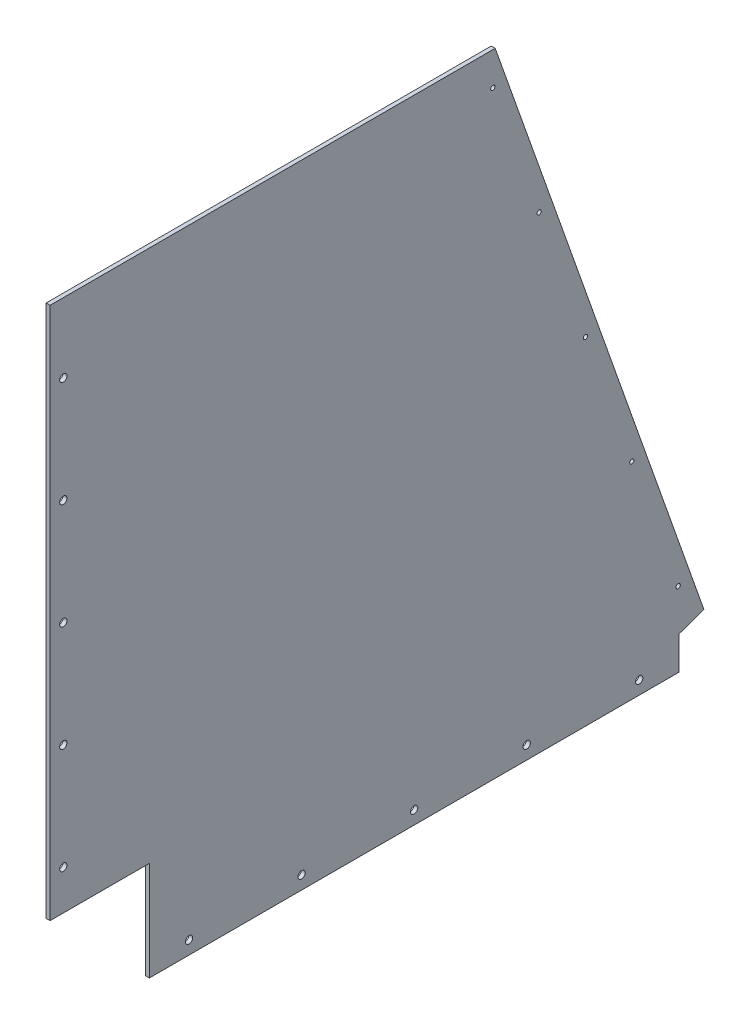
ISO-10303-21;
HEADER;
FILE_DESCRIPTION(('STEP AP214'),'2;1');
FILE_NAME('part.step','',(''),(''),'','','');
FILE_SCHEMA(('AUTOMOTIVE_DESIGN { 1 0 10303 214 1 1 1 1 }'));
ENDSEC;
DATA;
#1=APPLICATION_CONTEXT('core data for automotive mechanical design processes');
#2=APPLICATION_PROTOCOL_DEFINITION('international standard','automotive_design',2000,#1);
#3=PRODUCT_CONTEXT('',#1,'mechanical');
#4=PRODUCT('Part','Part','',(#3));
#5=PRODUCT_RELATED_PRODUCT_CATEGORY('part','',(#4));
#6=PRODUCT_DEFINITION_FORMATION('','',#4);
#7=PRODUCT_DEFINITION_CONTEXT('part definition',#1,'design');
#8=PRODUCT_DEFINITION('design','',#6,#7);
#9=PRODUCT_DEFINITION_SHAPE('','',#8);
#10=(LENGTH_UNIT() NAMED_UNIT(*) SI_UNIT(.MILLI.,.METRE.));
#11=(NAMED_UNIT(*) PLANE_ANGLE_UNIT() SI_UNIT($,.RADIAN.));
#12=(NAMED_UNIT(*) SI_UNIT($,.STERADIAN.) SOLID_ANGLE_UNIT());
#13=UNCERTAINTY_MEASURE_WITH_UNIT(LENGTH_MEASURE(1.E-05),#10,'distance_accuracy_value','');
#14=(GEOMETRIC_REPRESENTATION_CONTEXT(3) GLOBAL_UNCERTAINTY_ASSIGNED_CONTEXT((#13)) GLOBAL_UNIT_ASSIGNED_CONTEXT((#10,
#11,#12)) REPRESENTATION_CONTEXT('',''));
#15=CARTESIAN_POINT('',(0.,0.,0.));
#16=DIRECTION('',(0.,0.,1.));
#17=DIRECTION('',(1.,0.,0.));
#18=AXIS2_PLACEMENT_3D('',#15,#16,#17);
#19=CARTESIAN_POINT('',(3.,0.,0.));
#20=DIRECTION('',(-1.,0.,0.));
#21=DIRECTION('',(0.,0.,1.));
#22=AXIS2_PLACEMENT_3D('',#19,#20,#21);
#23=PLANE('',#22);
#24=CARTESIAN_POINT('',(3.,501.627796268499,-86.0977592121409));
#25=DIRECTION('',(1.,0.,0.));
#26=DIRECTION('',(0.,0.,-1.));
#27=AXIS2_PLACEMENT_3D('',#24,#25,#26);
#28=CIRCLE('',#27,1.60000000000005);
#29=CARTESIAN_POINT('',(3.,501.627796268499,-87.6977592121409));
#30=VERTEX_POINT('',#29);
#31=EDGE_CURVE('E185',#30,#30,#28,.T.);
#32=ORIENTED_EDGE('',*,*,#31,.F.);
#33=EDGE_LOOP('',(#32));
#34=FACE_BOUND('',#33,.T.);
#35=CARTESIAN_POINT('',(3.,600.622745634616,-51.0977592121409));
#36=DIRECTION('',(1.,0.,0.));
#37=DIRECTION('',(0.,0.,-1.));
#38=AXIS2_PLACEMENT_3D('',#35,#36,#37);
#39=CIRCLE('',#38,1.60000000000005);
#40=CARTESIAN_POINT('',(3.,600.622745634616,-52.6977592121409));
#41=VERTEX_POINT('',#40);
#42=EDGE_CURVE('E179',#41,#41,#39,.T.);
#43=ORIENTED_EDGE('',*,*,#42,.F.);
#44=EDGE_LOOP('',(#43));
#45=FACE_BOUND('',#44,.T.);
#46=DIRECTION('',(0.,-0.942809041582063,-0.333333333333333));
#47=VECTOR('',#46,1.);
#48=CARTESIAN_POINT('',(3.,632.240350215411,-50.5258496279613));
#49=LINE('',#48,#47);
#50=CARTESIAN_POINT('',(3.,625.573683548744,-52.8828722319166));
#51=VERTEX_POINT('',#50);
#52=CARTESIAN_POINT('',(3.,179.69201025602,-210.525849627961));
#53=VERTEX_POINT('',#52);
#54=EDGE_CURVE('E123',#51,#53,#49,.T.);
#55=ORIENTED_EDGE('',*,*,#54,.F.);
#56=DIRECTION('',(0.,0.,1.));
#57=VECTOR('',#56,1.);
#58=CARTESIAN_POINT('',(3.,625.573683548744,258.33033120368));
#59=LINE('',#58,#57);
#60=CARTESIAN_POINT('',(3.,625.573683548744,283.33033120368));
#61=VERTEX_POINT('',#60);
#62=EDGE_CURVE('E51',#51,#61,#59,.T.);
#63=ORIENTED_EDGE('',*,*,#62,.T.);
#64=DIRECTION('',(0.,1.,0.));
#65=VECTOR('',#64,1.);
#66=CARTESIAN_POINT('',(3.,625.573683548744,283.33033120368));
#67=LINE('',#66,#65);
#68=CARTESIAN_POINT('',(3.,223.025343589353,283.33033120368));
#69=VERTEX_POINT('',#68);
#70=EDGE_CURVE('E167',#69,#61,#67,.T.);
#71=ORIENTED_EDGE('',*,*,#70,.F.);
#72=DIRECTION('',(0.,0.,-1.));
#73=VECTOR('',#72,1.);
#74=CARTESIAN_POINT('',(3.,223.025343589353,0.));
#75=LINE('',#74,#73);
#76=CARTESIAN_POINT('',(3.,223.025343589353,208.33033120368));
#77=VERTEX_POINT('',#76);
#78=EDGE_CURVE('E136',#69,#77,#75,.T.);
#79=ORIENTED_EDGE('',*,*,#78,.T.);
#80=DIRECTION('',(0.,-1.,0.));
#81=VECTOR('',#80,1.);
#82=CARTESIAN_POINT('',(3.,0.,208.33033120368));
#83=LINE('',#82,#81);
#84=CARTESIAN_POINT('',(3.,148.025343589354,208.33033120368));
#85=VERTEX_POINT('',#84);
#86=EDGE_CURVE('E111',#77,#85,#83,.T.);
#87=ORIENTED_EDGE('',*,*,#86,.T.);
#88=DIRECTION('',(0.,0.,1.));
#89=VECTOR('',#88,1.);
#90=CARTESIAN_POINT('',(3.,148.025343589354,208.33033120368));
#91=LINE('',#90,#89);
#92=CARTESIAN_POINT('',(3.,148.025343589354,-191.66966879632));
#93=VERTEX_POINT('',#92);
#94=EDGE_CURVE('E162',#93,#85,#91,.T.);
#95=ORIENTED_EDGE('',*,*,#94,.F.);
#96=DIRECTION('',(0.,1.,0.));
#97=VECTOR('',#96,1.);
#98=CARTESIAN_POINT('',(3.,148.025343589354,-191.66966879632));
#99=LINE('',#98,#97);
#100=CARTESIAN_POINT('',(3.,173.025343589354,-191.66966879632));
#101=VERTEX_POINT('',#100);
#102=EDGE_CURVE('E148',#93,#101,#99,.T.);
#103=ORIENTED_EDGE('',*,*,#102,.T.);
#104=DIRECTION('',(0.,-0.333333333333333,0.942809041582063));
#105=VECTOR('',#104,1.);
#106=CARTESIAN_POINT('',(3.,179.69201025602,-210.525849627961));
#107=LINE('',#106,#105);
#108=EDGE_CURVE('E121',#53,#101,#107,.T.);
#109=ORIENTED_EDGE('',*,*,#108,.F.);
#110=EDGE_LOOP('',(#55,#63,#71,#79,#87,#95,#103,#109));
#111=FACE_BOUND('',#110,.T.);
#112=CARTESIAN_POINT('',(3.,402.632846902382,-121.097759212141));
#113=DIRECTION('',(1.,0.,0.));
#114=DIRECTION('',(0.,0.,-1.));
#115=AXIS2_PLACEMENT_3D('',#112,#113,#114);
#116=CIRCLE('',#115,1.59999999999999);
#117=CARTESIAN_POINT('',(3.,402.632846902382,-122.697759212141));
#118=VERTEX_POINT('',#117);
#119=EDGE_CURVE('E191',#118,#118,#116,.T.);
#120=ORIENTED_EDGE('',*,*,#119,.F.);
#121=EDGE_LOOP('',(#120));
#122=FACE_BOUND('',#121,.T.);
#123=CARTESIAN_POINT('',(3.,303.637897536266,-156.097759212141));
#124=DIRECTION('',(1.,0.,0.));
#125=DIRECTION('',(0.,0.,-1.));
#126=AXIS2_PLACEMENT_3D('',#123,#124,#125);
#127=CIRCLE('',#126,1.59999999999999);
#128=CARTESIAN_POINT('',(3.,303.637897536266,-157.697759212141));
#129=VERTEX_POINT('',#128);
#130=EDGE_CURVE('E197',#129,#129,#127,.T.);
#131=ORIENTED_EDGE('',*,*,#130,.F.);
#132=EDGE_LOOP('',(#131));
#133=FACE_BOUND('',#132,.T.);
#134=CARTESIAN_POINT('',(3.,204.642948170149,-191.097759212141));
#135=DIRECTION('',(1.,0.,0.));
#136=DIRECTION('',(0.,0.,-1.));
#137=AXIS2_PLACEMENT_3D('',#134,#135,#136);
#138=CIRCLE('',#137,1.59999999999999);
#139=CARTESIAN_POINT('',(3.,204.642948170149,-192.697759212141));
#140=VERTEX_POINT('',#139);
#141=EDGE_CURVE('E203',#140,#140,#138,.T.);
#142=ORIENTED_EDGE('',*,*,#141,.F.);
#143=EDGE_LOOP('',(#142));
#144=FACE_BOUND('',#143,.T.);
#145=CARTESIAN_POINT('',(3.,573.025343589353,273.33033120368));
#146=DIRECTION('',(1.,0.,0.));
#147=DIRECTION('',(0.,0.,-1.));
#148=AXIS2_PLACEMENT_3D('',#145,#146,#147);
#149=CIRCLE('',#148,2.75000000000003);
#150=CARTESIAN_POINT('',(3.,573.025343589353,270.58033120368));
#151=VERTEX_POINT('',#150);
#152=EDGE_CURVE('E209',#151,#151,#149,.T.);
#153=ORIENTED_EDGE('',*,*,#152,.F.);
#154=EDGE_LOOP('',(#153));
#155=FACE_BOUND('',#154,.T.);
#156=CARTESIAN_POINT('',(3.,493.025343589353,273.33033120368));
#157=DIRECTION('',(1.,0.,0.));
#158=DIRECTION('',(0.,0.,-1.));
#159=AXIS2_PLACEMENT_3D('',#156,#157,#158);
#160=CIRCLE('',#159,2.74999999999997);
#161=CARTESIAN_POINT('',(3.,493.025343589353,270.58033120368));
#162=VERTEX_POINT('',#161);
#163=EDGE_CURVE('E215',#162,#162,#160,.T.);
#164=ORIENTED_EDGE('',*,*,#163,.F.);
#165=EDGE_LOOP('',(#164));
#166=FACE_BOUND('',#165,.T.);
#167=CARTESIAN_POINT('',(3.,413.025343589353,273.33033120368));
#168=DIRECTION('',(1.,0.,0.));
#169=DIRECTION('',(0.,0.,-1.));
#170=AXIS2_PLACEMENT_3D('',#167,#168,#169);
#171=CIRCLE('',#170,2.74999999999997);
#172=CARTESIAN_POINT('',(3.,413.025343589353,270.58033120368));
#173=VERTEX_POINT('',#172);
#174=EDGE_CURVE('E221',#173,#173,#171,.T.);
#175=ORIENTED_EDGE('',*,*,#174,.F.);
#176=EDGE_LOOP('',(#175));
#177=FACE_BOUND('',#176,.T.);
#178=CARTESIAN_POINT('',(3.,333.025343589353,273.33033120368));
#179=DIRECTION('',(1.,0.,0.));
#180=DIRECTION('',(0.,0.,-1.));
#181=AXIS2_PLACEMENT_3D('',#178,#179,#180);
#182=CIRCLE('',#181,2.74999999999997);
#183=CARTESIAN_POINT('',(3.,333.025343589353,270.58033120368));
#184=VERTEX_POINT('',#183);
#185=EDGE_CURVE('E227',#184,#184,#182,.T.);
#186=ORIENTED_EDGE('',*,*,#185,.F.);
#187=EDGE_LOOP('',(#186));
#188=FACE_BOUND('',#187,.T.);
#189=CARTESIAN_POINT('',(3.,253.025343589353,273.33033120368));
#190=DIRECTION('',(1.,0.,0.));
#191=DIRECTION('',(0.,0.,-1.));
#192=AXIS2_PLACEMENT_3D('',#189,#190,#191);
#193=CIRCLE('',#192,2.74999999999997);
#194=CARTESIAN_POINT('',(3.,253.025343589353,270.58033120368));
#195=VERTEX_POINT('',#194);
#196=EDGE_CURVE('E233',#195,#195,#193,.T.);
#197=ORIENTED_EDGE('',*,*,#196,.F.);
#198=EDGE_LOOP('',(#197));
#199=FACE_BOUND('',#198,.T.);
#200=CARTESIAN_POINT('',(3.,158.025343589354,178.33033120368));
#201=DIRECTION('',(1.,0.,0.));
#202=DIRECTION('',(0.,0.,-1.));
#203=AXIS2_PLACEMENT_3D('',#200,#201,#202);
#204=CIRCLE('',#203,2.75);
#205=CARTESIAN_POINT('',(3.,158.025343589354,175.58033120368));
#206=VERTEX_POINT('',#205);
#207=EDGE_CURVE('E239',#206,#206,#204,.T.);
#208=ORIENTED_EDGE('',*,*,#207,.F.);
#209=EDGE_LOOP('',(#208));
#210=FACE_BOUND('',#209,.T.);
#211=CARTESIAN_POINT('',(3.,158.025343589354,93.3303312036799));
#212=DIRECTION('',(1.,0.,0.));
#213=DIRECTION('',(0.,0.,-1.));
#214=AXIS2_PLACEMENT_3D('',#211,#212,#213);
#215=CIRCLE('',#214,2.75);
#216=CARTESIAN_POINT('',(3.,158.025343589354,90.5803312036799));
#217=VERTEX_POINT('',#216);
#218=EDGE_CURVE('E245',#217,#217,#215,.T.);
#219=ORIENTED_EDGE('',*,*,#218,.F.);
#220=EDGE_LOOP('',(#219));
#221=FACE_BOUND('',#220,.T.);
#222=CARTESIAN_POINT('',(3.,158.025343589354,8.33033120367988));
#223=DIRECTION('',(1.,0.,0.));
#224=DIRECTION('',(0.,0.,-1.));
#225=AXIS2_PLACEMENT_3D('',#222,#223,#224);
#226=CIRCLE('',#225,2.75);
#227=CARTESIAN_POINT('',(3.,158.025343589354,5.58033120367987));
#228=VERTEX_POINT('',#227);
#229=EDGE_CURVE('E251',#228,#228,#226,.T.);
#230=ORIENTED_EDGE('',*,*,#229,.F.);
#231=EDGE_LOOP('',(#230));
#232=FACE_BOUND('',#231,.T.);
#233=CARTESIAN_POINT('',(3.,158.025343589354,-76.6696687963201));
#234=DIRECTION('',(1.,0.,0.));
#235=DIRECTION('',(0.,0.,-1.));
#236=AXIS2_PLACEMENT_3D('',#233,#234,#235);
#237=CIRCLE('',#236,2.75);
#238=CARTESIAN_POINT('',(3.,158.025343589354,-79.4196687963201));
#239=VERTEX_POINT('',#238);
#240=EDGE_CURVE('E257',#239,#239,#237,.T.);
#241=ORIENTED_EDGE('',*,*,#240,.F.);
#242=EDGE_LOOP('',(#241));
#243=FACE_BOUND('',#242,.T.);
#244=CARTESIAN_POINT('',(3.,158.025343589354,-161.66966879632));
#245=DIRECTION('',(1.,0.,0.));
#246=DIRECTION('',(0.,0.,-1.));
#247=AXIS2_PLACEMENT_3D('',#244,#245,#246);
#248=CIRCLE('',#247,2.75);
#249=CARTESIAN_POINT('',(3.,158.025343589354,-164.41966879632));
#250=VERTEX_POINT('',#249);
#251=EDGE_CURVE('E263',#250,#250,#248,.T.);
#252=ORIENTED_EDGE('',*,*,#251,.F.);
#253=EDGE_LOOP('',(#252));
#254=FACE_BOUND('',#253,.T.);
#255=ADVANCED_FACE('F37',(#34,#45,#111,#122,#133,#144,#155,#166,#177,#188,#199,#210,#221,#232,
#243,#254),#23,.F.);
#256=CARTESIAN_POINT('',(3.,625.573683548744,258.33033120368));
#257=DIRECTION('',(0.,-1.,0.));
#258=DIRECTION('',(0.,0.,-1.));
#259=AXIS2_PLACEMENT_3D('',#256,#257,#258);
#260=PLANE('',#259);
#261=DIRECTION('',(0.,0.,1.));
#262=VECTOR('',#261,1.);
#263=CARTESIAN_POINT('',(0.,625.573683548744,258.33033120368));
#264=LINE('',#263,#262);
#265=CARTESIAN_POINT('',(0.,625.573683548744,-52.8828722319166));
#266=VERTEX_POINT('',#265);
#267=CARTESIAN_POINT('',(0.,625.573683548744,283.33033120368));
#268=VERTEX_POINT('',#267);
#269=EDGE_CURVE('E103',#266,#268,#264,.T.);
#270=ORIENTED_EDGE('',*,*,#269,.T.);
#271=DIRECTION('',(-1.,0.,0.));
#272=VECTOR('',#271,1.);
#273=CARTESIAN_POINT('',(0.,625.573683548744,283.33033120368));
#274=LINE('',#273,#272);
#275=EDGE_CURVE('E165',#61,#268,#274,.T.);
#276=ORIENTED_EDGE('',*,*,#275,.F.);
#277=ORIENTED_EDGE('',*,*,#62,.F.);
#278=DIRECTION('',(-1.,0.,0.));
#279=VECTOR('',#278,1.);
#280=CARTESIAN_POINT('',(0.,625.573683548744,-52.8828722319166));
#281=LINE('',#280,#279);
#282=EDGE_CURVE('E11',#51,#266,#281,.T.);
#283=ORIENTED_EDGE('',*,*,#282,.T.);
#284=EDGE_LOOP('',(#270,#276,#277,#283));
#285=FACE_BOUND('',#284,.T.);
#286=ADVANCED_FACE('F39',(#285),#260,.F.);
#287=CARTESIAN_POINT('',(0.,0.,0.));
#288=DIRECTION('',(-1.,0.,0.));
#289=DIRECTION('',(0.,0.,1.));
#290=AXIS2_PLACEMENT_3D('',#287,#288,#289);
#291=PLANE('',#290);
#292=CARTESIAN_POINT('',(0.,158.025343589354,-161.66966879632));
#293=DIRECTION('',(-1.,0.,0.));
#294=DIRECTION('',(0.,0.,1.));
#295=AXIS2_PLACEMENT_3D('',#292,#293,#294);
#296=CIRCLE('',#295,2.75);
#297=CARTESIAN_POINT('',(0.,158.025343589354,-158.91966879632));
#298=VERTEX_POINT('',#297);
#299=EDGE_CURVE('E260',#298,#298,#296,.T.);
#300=ORIENTED_EDGE('',*,*,#299,.F.);
#301=EDGE_LOOP('',(#300));
#302=FACE_BOUND('',#301,.T.);
#303=CARTESIAN_POINT('',(0.,158.025343589354,-76.6696687963201));
#304=DIRECTION('',(-1.,0.,0.));
#305=DIRECTION('',(0.,0.,1.));
#306=AXIS2_PLACEMENT_3D('',#303,#304,#305);
#307=CIRCLE('',#306,2.75);
#308=CARTESIAN_POINT('',(0.,158.025343589354,-73.9196687963201));
#309=VERTEX_POINT('',#308);
#310=EDGE_CURVE('E254',#309,#309,#307,.T.);
#311=ORIENTED_EDGE('',*,*,#310,.F.);
#312=EDGE_LOOP('',(#311));
#313=FACE_BOUND('',#312,.T.);
#314=CARTESIAN_POINT('',(0.,158.025343589354,8.33033120367988));
#315=DIRECTION('',(-1.,0.,0.));
#316=DIRECTION('',(0.,0.,1.));
#317=AXIS2_PLACEMENT_3D('',#314,#315,#316);
#318=CIRCLE('',#317,2.75);
#319=CARTESIAN_POINT('',(0.,158.025343589354,11.0803312036799));
#320=VERTEX_POINT('',#319);
#321=EDGE_CURVE('E248',#320,#320,#318,.T.);
#322=ORIENTED_EDGE('',*,*,#321,.F.);
#323=EDGE_LOOP('',(#322));
#324=FACE_BOUND('',#323,.T.);
#325=CARTESIAN_POINT('',(0.,158.025343589354,93.3303312036799));
#326=DIRECTION('',(-1.,0.,0.));
#327=DIRECTION('',(0.,0.,1.));
#328=AXIS2_PLACEMENT_3D('',#325,#326,#327);
#329=CIRCLE('',#328,2.75);
#330=CARTESIAN_POINT('',(0.,158.025343589354,96.0803312036799));
#331=VERTEX_POINT('',#330);
#332=EDGE_CURVE('E242',#331,#331,#329,.T.);
#333=ORIENTED_EDGE('',*,*,#332,.F.);
#334=EDGE_LOOP('',(#333));
#335=FACE_BOUND('',#334,.T.);
#336=CARTESIAN_POINT('',(0.,158.025343589354,178.33033120368));
#337=DIRECTION('',(-1.,0.,0.));
#338=DIRECTION('',(0.,0.,1.));
#339=AXIS2_PLACEMENT_3D('',#336,#337,#338);
#340=CIRCLE('',#339,2.75);
#341=CARTESIAN_POINT('',(0.,158.025343589354,181.08033120368));
#342=VERTEX_POINT('',#341);
#343=EDGE_CURVE('E236',#342,#342,#340,.T.);
#344=ORIENTED_EDGE('',*,*,#343,.F.);
#345=EDGE_LOOP('',(#344));
#346=FACE_BOUND('',#345,.T.);
#347=CARTESIAN_POINT('',(0.,253.025343589353,273.33033120368));
#348=DIRECTION('',(-1.,0.,0.));
#349=DIRECTION('',(0.,0.,1.));
#350=AXIS2_PLACEMENT_3D('',#347,#348,#349);
#351=CIRCLE('',#350,2.74999999999997);
#352=CARTESIAN_POINT('',(0.,253.025343589353,276.08033120368));
#353=VERTEX_POINT('',#352);
#354=EDGE_CURVE('E230',#353,#353,#351,.T.);
#355=ORIENTED_EDGE('',*,*,#354,.F.);
#356=EDGE_LOOP('',(#355));
#357=FACE_BOUND('',#356,.T.);
#358=CARTESIAN_POINT('',(0.,333.025343589353,273.33033120368));
#359=DIRECTION('',(-1.,0.,0.));
#360=DIRECTION('',(0.,0.,1.));
#361=AXIS2_PLACEMENT_3D('',#358,#359,#360);
#362=CIRCLE('',#361,2.74999999999997);
#363=CARTESIAN_POINT('',(0.,333.025343589353,276.08033120368));
#364=VERTEX_POINT('',#363);
#365=EDGE_CURVE('E224',#364,#364,#362,.T.);
#366=ORIENTED_EDGE('',*,*,#365,.F.);
#367=EDGE_LOOP('',(#366));
#368=FACE_BOUND('',#367,.T.);
#369=CARTESIAN_POINT('',(0.,413.025343589353,273.33033120368));
#370=DIRECTION('',(-1.,0.,0.));
#371=DIRECTION('',(0.,0.,1.));
#372=AXIS2_PLACEMENT_3D('',#369,#370,#371);
#373=CIRCLE('',#372,2.74999999999997);
#374=CARTESIAN_POINT('',(0.,413.025343589353,276.08033120368));
#375=VERTEX_POINT('',#374);
#376=EDGE_CURVE('E218',#375,#375,#373,.T.);
#377=ORIENTED_EDGE('',*,*,#376,.F.);
#378=EDGE_LOOP('',(#377));
#379=FACE_BOUND('',#378,.T.);
#380=CARTESIAN_POINT('',(0.,493.025343589353,273.33033120368));
#381=DIRECTION('',(-1.,0.,0.));
#382=DIRECTION('',(0.,0.,1.));
#383=AXIS2_PLACEMENT_3D('',#380,#381,#382);
#384=CIRCLE('',#383,2.74999999999997);
#385=CARTESIAN_POINT('',(0.,493.025343589353,276.08033120368));
#386=VERTEX_POINT('',#385);
#387=EDGE_CURVE('E212',#386,#386,#384,.T.);
#388=ORIENTED_EDGE('',*,*,#387,.F.);
#389=EDGE_LOOP('',(#388));
#390=FACE_BOUND('',#389,.T.);
#391=CARTESIAN_POINT('',(0.,573.025343589353,273.33033120368));
#392=DIRECTION('',(-1.,0.,0.));
#393=DIRECTION('',(0.,0.,1.));
#394=AXIS2_PLACEMENT_3D('',#391,#392,#393);
#395=CIRCLE('',#394,2.75000000000003);
#396=CARTESIAN_POINT('',(0.,573.025343589353,276.08033120368));
#397=VERTEX_POINT('',#396);
#398=EDGE_CURVE('E206',#397,#397,#395,.T.);
#399=ORIENTED_EDGE('',*,*,#398,.F.);
#400=EDGE_LOOP('',(#399));
#401=FACE_BOUND('',#400,.T.);
#402=CARTESIAN_POINT('',(0.,204.642948170149,-191.097759212141));
#403=DIRECTION('',(-1.,0.,0.));
#404=DIRECTION('',(0.,0.,1.));
#405=AXIS2_PLACEMENT_3D('',#402,#403,#404);
#406=CIRCLE('',#405,1.59999999999999);
#407=CARTESIAN_POINT('',(0.,204.642948170149,-189.497759212141));
#408=VERTEX_POINT('',#407);
#409=EDGE_CURVE('E200',#408,#408,#406,.T.);
#410=ORIENTED_EDGE('',*,*,#409,.F.);
#411=EDGE_LOOP('',(#410));
#412=FACE_BOUND('',#411,.T.);
#413=CARTESIAN_POINT('',(0.,303.637897536266,-156.097759212141));
#414=DIRECTION('',(-1.,0.,0.));
#415=DIRECTION('',(0.,0.,1.));
#416=AXIS2_PLACEMENT_3D('',#413,#414,#415);
#417=CIRCLE('',#416,1.59999999999999);
#418=CARTESIAN_POINT('',(0.,303.637897536266,-154.497759212141));
#419=VERTEX_POINT('',#418);
#420=EDGE_CURVE('E194',#419,#419,#417,.T.);
#421=ORIENTED_EDGE('',*,*,#420,.F.);
#422=EDGE_LOOP('',(#421));
#423=FACE_BOUND('',#422,.T.);
#424=CARTESIAN_POINT('',(0.,402.632846902382,-121.097759212141));
#425=DIRECTION('',(-1.,0.,0.));
#426=DIRECTION('',(0.,0.,1.));
#427=AXIS2_PLACEMENT_3D('',#424,#425,#426);
#428=CIRCLE('',#427,1.59999999999999);
#429=CARTESIAN_POINT('',(0.,402.632846902382,-119.497759212141));
#430=VERTEX_POINT('',#429);
#431=EDGE_CURVE('E188',#430,#430,#428,.T.);
#432=ORIENTED_EDGE('',*,*,#431,.F.);
#433=EDGE_LOOP('',(#432));
#434=FACE_BOUND('',#433,.T.);
#435=CARTESIAN_POINT('',(0.,501.627796268499,-86.0977592121409));
#436=DIRECTION('',(-1.,0.,0.));
#437=DIRECTION('',(0.,0.,1.));
#438=AXIS2_PLACEMENT_3D('',#435,#436,#437);
#439=CIRCLE('',#438,1.60000000000005);
#440=CARTESIAN_POINT('',(0.,501.627796268499,-84.4977592121408));
#441=VERTEX_POINT('',#440);
#442=EDGE_CURVE('E182',#441,#441,#439,.T.);
#443=ORIENTED_EDGE('',*,*,#442,.F.);
#444=EDGE_LOOP('',(#443));
#445=FACE_BOUND('',#444,.T.);
#446=CARTESIAN_POINT('',(0.,600.622745634616,-51.0977592121409));
#447=DIRECTION('',(-1.,0.,0.));
#448=DIRECTION('',(0.,0.,1.));
#449=AXIS2_PLACEMENT_3D('',#446,#447,#448);
#450=CIRCLE('',#449,1.60000000000005);
#451=CARTESIAN_POINT('',(0.,600.622745634616,-49.4977592121408));
#452=VERTEX_POINT('',#451);
#453=EDGE_CURVE('E176',#452,#452,#450,.T.);
#454=ORIENTED_EDGE('',*,*,#453,.F.);
#455=EDGE_LOOP('',(#454));
#456=FACE_BOUND('',#455,.T.);
#457=ORIENTED_EDGE('',*,*,#269,.F.);
#458=DIRECTION('',(0.,0.942809041582063,0.333333333333333));
#459=VECTOR('',#458,1.);
#460=CARTESIAN_POINT('',(0.,632.240350215411,-50.5258496279613));
#461=LINE('',#460,#459);
#462=CARTESIAN_POINT('',(0.,179.69201025602,-210.525849627961));
#463=VERTEX_POINT('',#462);
#464=EDGE_CURVE('E107',#463,#266,#461,.T.);
#465=ORIENTED_EDGE('',*,*,#464,.F.);
#466=DIRECTION('',(0.,-0.333333333333333,0.942809041582063));
#467=VECTOR('',#466,1.);
#468=CARTESIAN_POINT('',(0.,179.69201025602,-210.525849627961));
#469=LINE('',#468,#467);
#470=CARTESIAN_POINT('',(0.,173.025343589354,-191.66966879632));
#471=VERTEX_POINT('',#470);
#472=EDGE_CURVE('E119',#463,#471,#469,.T.);
#473=ORIENTED_EDGE('',*,*,#472,.T.);
#474=DIRECTION('',(0.,1.,0.));
#475=VECTOR('',#474,1.);
#476=CARTESIAN_POINT('',(0.,148.025343589354,-191.66966879632));
#477=LINE('',#476,#475);
#478=CARTESIAN_POINT('',(0.,148.025343589354,-191.66966879632));
#479=VERTEX_POINT('',#478);
#480=EDGE_CURVE('E59',#479,#471,#477,.T.);
#481=ORIENTED_EDGE('',*,*,#480,.F.);
#482=DIRECTION('',(0.,0.,-1.));
#483=VECTOR('',#482,1.);
#484=CARTESIAN_POINT('',(0.,148.025343589354,208.33033120368));
#485=LINE('',#484,#483);
#486=CARTESIAN_POINT('',(0.,148.025343589354,208.33033120368));
#487=VERTEX_POINT('',#486);
#488=EDGE_CURVE('E147',#487,#479,#485,.T.);
#489=ORIENTED_EDGE('',*,*,#488,.F.);
#490=DIRECTION('',(0.,-1.,0.));
#491=VECTOR('',#490,1.);
#492=CARTESIAN_POINT('',(0.,173.025343589353,208.33033120368));
#493=LINE('',#492,#491);
#494=CARTESIAN_POINT('',(0.,223.025343589353,208.33033120368));
#495=VERTEX_POINT('',#494);
#496=EDGE_CURVE('E132',#495,#487,#493,.T.);
#497=ORIENTED_EDGE('',*,*,#496,.F.);
#498=DIRECTION('',(0.,0.,-1.));
#499=VECTOR('',#498,1.);
#500=CARTESIAN_POINT('',(0.,223.025343589353,258.33033120368));
#501=LINE('',#500,#499);
#502=CARTESIAN_POINT('',(0.,223.025343589353,283.33033120368));
#503=VERTEX_POINT('',#502);
#504=EDGE_CURVE('E129',#503,#495,#501,.T.);
#505=ORIENTED_EDGE('',*,*,#504,.F.);
#506=DIRECTION('',(0.,-1.,0.));
#507=VECTOR('',#506,1.);
#508=CARTESIAN_POINT('',(0.,625.573683548744,283.33033120368));
#509=LINE('',#508,#507);
#510=EDGE_CURVE('E109',#268,#503,#509,.T.);
#511=ORIENTED_EDGE('',*,*,#510,.F.);
#512=EDGE_LOOP('',(#457,#465,#473,#481,#489,#497,#505,#511));
#513=FACE_BOUND('',#512,.T.);
#514=ADVANCED_FACE('F104',(#302,#313,#324,#335,#346,#357,#368,#379,#390,#401,#412,#423,#434,
#445,#456,#513),#291,.T.);
#515=CARTESIAN_POINT('',(10.,173.025343589353,208.33033120368));
#516=DIRECTION('',(0.,0.,-1.));
#517=DIRECTION('',(-1.,0.,0.));
#518=AXIS2_PLACEMENT_3D('',#515,#516,#517);
#519=PLANE('',#518);
#520=DIRECTION('',(-1.,0.,0.));
#521=VECTOR('',#520,1.);
#522=CARTESIAN_POINT('',(10.,223.025343589353,208.33033120368));
#523=LINE('',#522,#521);
#524=EDGE_CURVE('E134',#77,#495,#523,.T.);
#525=ORIENTED_EDGE('',*,*,#524,.T.);
#526=ORIENTED_EDGE('',*,*,#496,.T.);
#527=DIRECTION('',(-1.,0.,0.));
#528=VECTOR('',#527,1.);
#529=CARTESIAN_POINT('',(3.,148.025343589354,208.33033120368));
#530=LINE('',#529,#528);
#531=EDGE_CURVE('E157',#85,#487,#530,.T.);
#532=ORIENTED_EDGE('',*,*,#531,.F.);
#533=ORIENTED_EDGE('',*,*,#86,.F.);
#534=EDGE_LOOP('',(#525,#526,#532,#533));
#535=FACE_BOUND('',#534,.T.);
#536=ADVANCED_FACE('F282',(#535),#519,.F.);
#537=CARTESIAN_POINT('',(10.,223.025343589353,258.33033120368));
#538=DIRECTION('',(0.,1.,0.));
#539=DIRECTION('',(0.,0.,1.));
#540=AXIS2_PLACEMENT_3D('',#537,#538,#539);
#541=PLANE('',#540);
#542=ORIENTED_EDGE('',*,*,#78,.F.);
#543=DIRECTION('',(1.,0.,0.));
#544=VECTOR('',#543,1.);
#545=CARTESIAN_POINT('',(0.,223.025343589353,283.33033120368));
#546=LINE('',#545,#544);
#547=EDGE_CURVE('E172',#503,#69,#546,.T.);
#548=ORIENTED_EDGE('',*,*,#547,.F.);
#549=ORIENTED_EDGE('',*,*,#504,.T.);
#550=ORIENTED_EDGE('',*,*,#524,.F.);
#551=EDGE_LOOP('',(#542,#548,#549,#550));
#552=FACE_BOUND('',#551,.T.);
#553=ADVANCED_FACE('F279',(#552),#541,.F.);
#554=CARTESIAN_POINT('',(3.,179.69201025602,-210.525849627961));
#555=DIRECTION('',(0.,0.942809041582063,0.333333333333333));
#556=DIRECTION('',(0.,-0.333333333333333,0.942809041582063));
#557=AXIS2_PLACEMENT_3D('',#554,#555,#556);
#558=PLANE('',#557);
#559=DIRECTION('',(-1.,0.,0.));
#560=VECTOR('',#559,1.);
#561=CARTESIAN_POINT('',(3.,173.025343589354,-191.66966879632));
#562=LINE('',#561,#560);
#563=EDGE_CURVE('E45',#101,#471,#562,.T.);
#564=ORIENTED_EDGE('',*,*,#563,.T.);
#565=ORIENTED_EDGE('',*,*,#472,.F.);
#566=DIRECTION('',(-1.,0.,0.));
#567=VECTOR('',#566,1.);
#568=CARTESIAN_POINT('',(3.,179.69201025602,-210.525849627961));
#569=LINE('',#568,#567);
#570=EDGE_CURVE('E117',#53,#463,#569,.T.);
#571=ORIENTED_EDGE('',*,*,#570,.F.);
#572=ORIENTED_EDGE('',*,*,#108,.T.);
#573=EDGE_LOOP('',(#564,#565,#571,#572));
#574=FACE_BOUND('',#573,.T.);
#575=ADVANCED_FACE('F141',(#574),#558,.F.);
#576=CARTESIAN_POINT('',(0.,86.1276704226649,-243.605839214666));
#577=DIRECTION('',(0.,0.333333333333333,-0.942809041582063));
#578=DIRECTION('',(0.,0.942809041582063,0.333333333333333));
#579=AXIS2_PLACEMENT_3D('',#576,#577,#578);
#580=PLANE('',#579);
#581=ORIENTED_EDGE('',*,*,#282,.F.);
#582=ORIENTED_EDGE('',*,*,#54,.T.);
#583=ORIENTED_EDGE('',*,*,#570,.T.);
#584=ORIENTED_EDGE('',*,*,#464,.T.);
#585=EDGE_LOOP('',(#581,#582,#583,#584));
#586=FACE_BOUND('',#585,.T.);
#587=ADVANCED_FACE('F115',(#586),#580,.T.);
#588=CARTESIAN_POINT('',(3.,148.025343589354,-191.66966879632));
#589=DIRECTION('',(0.,0.,1.));
#590=DIRECTION('',(0.,-1.,0.));
#591=AXIS2_PLACEMENT_3D('',#588,#589,#590);
#592=PLANE('',#591);
#593=ORIENTED_EDGE('',*,*,#563,.F.);
#594=ORIENTED_EDGE('',*,*,#102,.F.);
#595=DIRECTION('',(1.,0.,0.));
#596=VECTOR('',#595,1.);
#597=CARTESIAN_POINT('',(3.,148.025343589354,-191.66966879632));
#598=LINE('',#597,#596);
#599=EDGE_CURVE('E150',#479,#93,#598,.T.);
#600=ORIENTED_EDGE('',*,*,#599,.F.);
#601=ORIENTED_EDGE('',*,*,#480,.T.);
#602=EDGE_LOOP('',(#593,#594,#600,#601));
#603=FACE_BOUND('',#602,.T.);
#604=ADVANCED_FACE('F151',(#603),#592,.F.);
#605=CARTESIAN_POINT('',(0.,148.025343589354,0.));
#606=DIRECTION('',(0.,1.,0.));
#607=DIRECTION('',(0.,0.,1.));
#608=AXIS2_PLACEMENT_3D('',#605,#606,#607);
#609=PLANE('',#608);
#610=ORIENTED_EDGE('',*,*,#94,.T.);
#611=ORIENTED_EDGE('',*,*,#531,.T.);
#612=ORIENTED_EDGE('',*,*,#488,.T.);
#613=ORIENTED_EDGE('',*,*,#599,.T.);
#614=EDGE_LOOP('',(#610,#611,#612,#613));
#615=FACE_BOUND('',#614,.T.);
#616=ADVANCED_FACE('F331',(#615),#609,.F.);
#617=CARTESIAN_POINT('',(0.,0.,283.33033120368));
#618=DIRECTION('',(0.,0.,1.));
#619=DIRECTION('',(1.,0.,0.));
#620=AXIS2_PLACEMENT_3D('',#617,#618,#619);
#621=PLANE('',#620);
#622=ORIENTED_EDGE('',*,*,#510,.T.);
#623=ORIENTED_EDGE('',*,*,#547,.T.);
#624=ORIENTED_EDGE('',*,*,#70,.T.);
#625=ORIENTED_EDGE('',*,*,#275,.T.);
#626=EDGE_LOOP('',(#622,#623,#624,#625));
#627=FACE_BOUND('',#626,.T.);
#628=ADVANCED_FACE('F321',(#627),#621,.T.);
#629=CARTESIAN_POINT('',(3.,600.622745634616,-51.0977592121409));
#630=DIRECTION('',(1.,0.,0.));
#631=DIRECTION('',(0.,0.,-1.));
#632=AXIS2_PLACEMENT_3D('',#629,#630,#631);
#633=CYLINDRICAL_SURFACE('',#632,1.60000000000005);
#634=ORIENTED_EDGE('',*,*,#42,.T.);
#635=EDGE_LOOP('',(#634));
#636=FACE_BOUND('',#635,.T.);
#637=ORIENTED_EDGE('',*,*,#453,.T.);
#638=EDGE_LOOP('',(#637));
#639=FACE_BOUND('',#638,.T.);
#640=ADVANCED_FACE('F318',(#636,#639),#633,.F.);
#641=CARTESIAN_POINT('',(3.,501.627796268499,-86.0977592121409));
#642=DIRECTION('',(1.,0.,0.));
#643=DIRECTION('',(0.,0.,-1.));
#644=AXIS2_PLACEMENT_3D('',#641,#642,#643);
#645=CYLINDRICAL_SURFACE('',#644,1.60000000000005);
#646=ORIENTED_EDGE('',*,*,#31,.T.);
#647=EDGE_LOOP('',(#646));
#648=FACE_BOUND('',#647,.T.);
#649=ORIENTED_EDGE('',*,*,#442,.T.);
#650=EDGE_LOOP('',(#649));
#651=FACE_BOUND('',#650,.T.);
#652=ADVANCED_FACE('F320',(#648,#651),#645,.F.);
#653=CARTESIAN_POINT('',(3.,402.632846902382,-121.097759212141));
#654=DIRECTION('',(1.,0.,0.));
#655=DIRECTION('',(0.,0.,-1.));
#656=AXIS2_PLACEMENT_3D('',#653,#654,#655);
#657=CYLINDRICAL_SURFACE('',#656,1.59999999999999);
#658=ORIENTED_EDGE('',*,*,#119,.T.);
#659=EDGE_LOOP('',(#658));
#660=FACE_BOUND('',#659,.T.);
#661=ORIENTED_EDGE('',*,*,#431,.T.);
#662=EDGE_LOOP('',(#661));
#663=FACE_BOUND('',#662,.T.);
#664=ADVANCED_FACE('F328',(#660,#663),#657,.F.);
#665=CARTESIAN_POINT('',(3.,303.637897536266,-156.097759212141));
#666=DIRECTION('',(1.,0.,0.));
#667=DIRECTION('',(0.,0.,-1.));
#668=AXIS2_PLACEMENT_3D('',#665,#666,#667);
#669=CYLINDRICAL_SURFACE('',#668,1.59999999999999);
#670=ORIENTED_EDGE('',*,*,#130,.T.);
#671=EDGE_LOOP('',(#670));
#672=FACE_BOUND('',#671,.T.);
#673=ORIENTED_EDGE('',*,*,#420,.T.);
#674=EDGE_LOOP('',(#673));
#675=FACE_BOUND('',#674,.T.);
#676=ADVANCED_FACE('F413',(#672,#675),#669,.F.);
#677=CARTESIAN_POINT('',(3.,204.642948170149,-191.097759212141));
#678=DIRECTION('',(1.,0.,0.));
#679=DIRECTION('',(0.,0.,-1.));
#680=AXIS2_PLACEMENT_3D('',#677,#678,#679);
#681=CYLINDRICAL_SURFACE('',#680,1.59999999999999);
#682=ORIENTED_EDGE('',*,*,#141,.T.);
#683=EDGE_LOOP('',(#682));
#684=FACE_BOUND('',#683,.T.);
#685=ORIENTED_EDGE('',*,*,#409,.T.);
#686=EDGE_LOOP('',(#685));
#687=FACE_BOUND('',#686,.T.);
#688=ADVANCED_FACE('F422',(#684,#687),#681,.F.);
#689=CARTESIAN_POINT('',(3.,573.025343589353,273.33033120368));
#690=DIRECTION('',(1.,0.,0.));
#691=DIRECTION('',(0.,0.,-1.));
#692=AXIS2_PLACEMENT_3D('',#689,#690,#691);
#693=CYLINDRICAL_SURFACE('',#692,2.75000000000003);
#694=ORIENTED_EDGE('',*,*,#152,.T.);
#695=EDGE_LOOP('',(#694));
#696=FACE_BOUND('',#695,.T.);
#697=ORIENTED_EDGE('',*,*,#398,.T.);
#698=EDGE_LOOP('',(#697));
#699=FACE_BOUND('',#698,.T.);
#700=ADVANCED_FACE('F431',(#696,#699),#693,.F.);
#701=CARTESIAN_POINT('',(3.,493.025343589353,273.33033120368));
#702=DIRECTION('',(1.,0.,0.));
#703=DIRECTION('',(0.,0.,-1.));
#704=AXIS2_PLACEMENT_3D('',#701,#702,#703);
#705=CYLINDRICAL_SURFACE('',#704,2.74999999999997);
#706=ORIENTED_EDGE('',*,*,#163,.T.);
#707=EDGE_LOOP('',(#706));
#708=FACE_BOUND('',#707,.T.);
#709=ORIENTED_EDGE('',*,*,#387,.T.);
#710=EDGE_LOOP('',(#709));
#711=FACE_BOUND('',#710,.T.);
#712=ADVANCED_FACE('F452',(#708,#711),#705,.F.);
#713=CARTESIAN_POINT('',(3.,413.025343589353,273.33033120368));
#714=DIRECTION('',(1.,0.,0.));
#715=DIRECTION('',(0.,0.,-1.));
#716=AXIS2_PLACEMENT_3D('',#713,#714,#715);
#717=CYLINDRICAL_SURFACE('',#716,2.74999999999997);
#718=ORIENTED_EDGE('',*,*,#174,.T.);
#719=EDGE_LOOP('',(#718));
#720=FACE_BOUND('',#719,.T.);
#721=ORIENTED_EDGE('',*,*,#376,.T.);
#722=EDGE_LOOP('',(#721));
#723=FACE_BOUND('',#722,.T.);
#724=ADVANCED_FACE('F462',(#720,#723),#717,.F.);
#725=CARTESIAN_POINT('',(3.,333.025343589353,273.33033120368));
#726=DIRECTION('',(1.,0.,0.));
#727=DIRECTION('',(0.,0.,-1.));
#728=AXIS2_PLACEMENT_3D('',#725,#726,#727);
#729=CYLINDRICAL_SURFACE('',#728,2.74999999999997);
#730=ORIENTED_EDGE('',*,*,#185,.T.);
#731=EDGE_LOOP('',(#730));
#732=FACE_BOUND('',#731,.T.);
#733=ORIENTED_EDGE('',*,*,#365,.T.);
#734=EDGE_LOOP('',(#733));
#735=FACE_BOUND('',#734,.T.);
#736=ADVANCED_FACE('F472',(#732,#735),#729,.F.);
#737=CARTESIAN_POINT('',(3.,253.025343589353,273.33033120368));
#738=DIRECTION('',(1.,0.,0.));
#739=DIRECTION('',(0.,0.,-1.));
#740=AXIS2_PLACEMENT_3D('',#737,#738,#739);
#741=CYLINDRICAL_SURFACE('',#740,2.74999999999997);
#742=ORIENTED_EDGE('',*,*,#196,.T.);
#743=EDGE_LOOP('',(#742));
#744=FACE_BOUND('',#743,.T.);
#745=ORIENTED_EDGE('',*,*,#354,.T.);
#746=EDGE_LOOP('',(#745));
#747=FACE_BOUND('',#746,.T.);
#748=ADVANCED_FACE('F482',(#744,#747),#741,.F.);
#749=CARTESIAN_POINT('',(3.,158.025343589354,178.33033120368));
#750=DIRECTION('',(1.,0.,0.));
#751=DIRECTION('',(0.,0.,-1.));
#752=AXIS2_PLACEMENT_3D('',#749,#750,#751);
#753=CYLINDRICAL_SURFACE('',#752,2.75);
#754=ORIENTED_EDGE('',*,*,#207,.T.);
#755=EDGE_LOOP('',(#754));
#756=FACE_BOUND('',#755,.T.);
#757=ORIENTED_EDGE('',*,*,#343,.T.);
#758=EDGE_LOOP('',(#757));
#759=FACE_BOUND('',#758,.T.);
#760=ADVANCED_FACE('F492',(#756,#759),#753,.F.);
#761=CARTESIAN_POINT('',(3.,158.025343589354,93.3303312036799));
#762=DIRECTION('',(1.,0.,0.));
#763=DIRECTION('',(0.,0.,-1.));
#764=AXIS2_PLACEMENT_3D('',#761,#762,#763);
#765=CYLINDRICAL_SURFACE('',#764,2.75);
#766=ORIENTED_EDGE('',*,*,#218,.T.);
#767=EDGE_LOOP('',(#766));
#768=FACE_BOUND('',#767,.T.);
#769=ORIENTED_EDGE('',*,*,#332,.T.);
#770=EDGE_LOOP('',(#769));
#771=FACE_BOUND('',#770,.T.);
#772=ADVANCED_FACE('F502',(#768,#771),#765,.F.);
#773=CARTESIAN_POINT('',(3.,158.025343589354,8.33033120367988));
#774=DIRECTION('',(1.,0.,0.));
#775=DIRECTION('',(0.,0.,-1.));
#776=AXIS2_PLACEMENT_3D('',#773,#774,#775);
#777=CYLINDRICAL_SURFACE('',#776,2.75);
#778=ORIENTED_EDGE('',*,*,#229,.T.);
#779=EDGE_LOOP('',(#778));
#780=FACE_BOUND('',#779,.T.);
#781=ORIENTED_EDGE('',*,*,#321,.T.);
#782=EDGE_LOOP('',(#781));
#783=FACE_BOUND('',#782,.T.);
#784=ADVANCED_FACE('F512',(#780,#783),#777,.F.);
#785=CARTESIAN_POINT('',(3.,158.025343589354,-76.6696687963201));
#786=DIRECTION('',(1.,0.,0.));
#787=DIRECTION('',(0.,0.,-1.));
#788=AXIS2_PLACEMENT_3D('',#785,#786,#787);
#789=CYLINDRICAL_SURFACE('',#788,2.75);
#790=ORIENTED_EDGE('',*,*,#240,.T.);
#791=EDGE_LOOP('',(#790));
#792=FACE_BOUND('',#791,.T.);
#793=ORIENTED_EDGE('',*,*,#310,.T.);
#794=EDGE_LOOP('',(#793));
#795=FACE_BOUND('',#794,.T.);
#796=ADVANCED_FACE('F522',(#792,#795),#789,.F.);
#797=CARTESIAN_POINT('',(3.,158.025343589354,-161.66966879632));
#798=DIRECTION('',(1.,0.,0.));
#799=DIRECTION('',(0.,0.,-1.));
#800=AXIS2_PLACEMENT_3D('',#797,#798,#799);
#801=CYLINDRICAL_SURFACE('',#800,2.75);
#802=ORIENTED_EDGE('',*,*,#251,.T.);
#803=EDGE_LOOP('',(#802));
#804=FACE_BOUND('',#803,.T.);
#805=ORIENTED_EDGE('',*,*,#299,.T.);
#806=EDGE_LOOP('',(#805));
#807=FACE_BOUND('',#806,.T.);
#808=ADVANCED_FACE('F267',(#804,#807),#801,.F.);
#809=CLOSED_SHELL('',(#255,#286,#514,#536,#553,#575,#587,#604,#616,#628,#640,#652,#664,#676,
#688,#700,#712,#724,#736,#748,#760,#772,#784,#796,#808));
#810=MANIFOLD_SOLID_BREP('B2',#809);
#811=ADVANCED_BREP_SHAPE_REPRESENTATION('',(#18,#810),#14);
#812=SHAPE_DEFINITION_REPRESENTATION(#9,#811);
ENDSEC;
END-ISO-10303-21;
